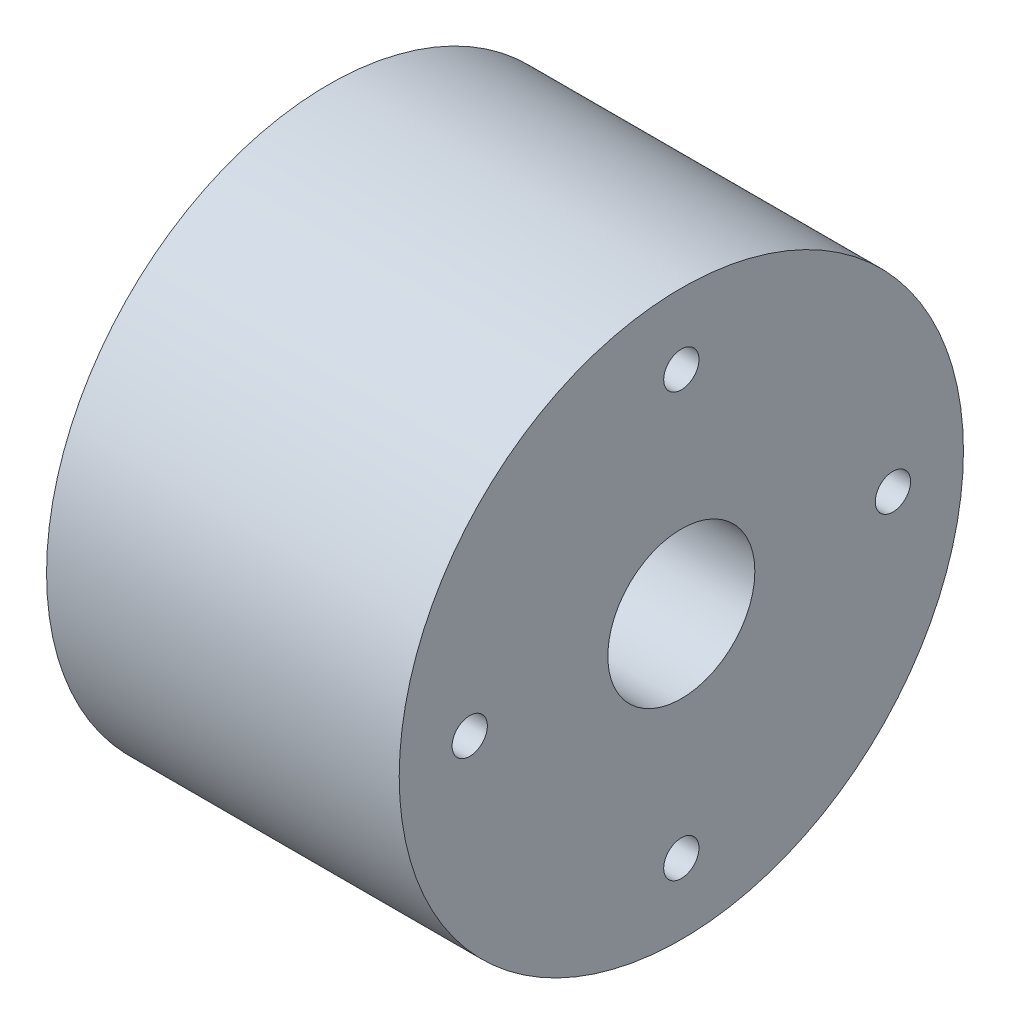
ISO-10303-21;
HEADER;
FILE_DESCRIPTION(('STEP AP214'),'2;1');
FILE_NAME('part.step','',(''),(''),'','','');
FILE_SCHEMA(('AUTOMOTIVE_DESIGN { 1 0 10303 214 1 1 1 1 }'));
ENDSEC;
DATA;
#1=APPLICATION_CONTEXT('core data for automotive mechanical design processes');
#2=APPLICATION_PROTOCOL_DEFINITION('international standard','automotive_design',2000,#1);
#3=PRODUCT_CONTEXT('',#1,'mechanical');
#4=PRODUCT('Part','Part','',(#3));
#5=PRODUCT_RELATED_PRODUCT_CATEGORY('part','',(#4));
#6=PRODUCT_DEFINITION_FORMATION('','',#4);
#7=PRODUCT_DEFINITION_CONTEXT('part definition',#1,'design');
#8=PRODUCT_DEFINITION('design','',#6,#7);
#9=PRODUCT_DEFINITION_SHAPE('','',#8);
#10=(LENGTH_UNIT() NAMED_UNIT(*) SI_UNIT(.MILLI.,.METRE.));
#11=(NAMED_UNIT(*) PLANE_ANGLE_UNIT() SI_UNIT($,.RADIAN.));
#12=(NAMED_UNIT(*) SI_UNIT($,.STERADIAN.) SOLID_ANGLE_UNIT());
#13=UNCERTAINTY_MEASURE_WITH_UNIT(LENGTH_MEASURE(1.E-05),#10,'distance_accuracy_value','');
#14=(GEOMETRIC_REPRESENTATION_CONTEXT(3) GLOBAL_UNCERTAINTY_ASSIGNED_CONTEXT((#13)) GLOBAL_UNIT_ASSIGNED_CONTEXT((#10,
#11,#12)) REPRESENTATION_CONTEXT('',''));
#15=CARTESIAN_POINT('',(0.,0.,0.));
#16=DIRECTION('',(0.,0.,1.));
#17=DIRECTION('',(1.,0.,0.));
#18=AXIS2_PLACEMENT_3D('',#15,#16,#17);
#19=CARTESIAN_POINT('',(20.1841307962118,0.,0.));
#20=DIRECTION('',(1.,0.,0.));
#21=DIRECTION('',(0.,0.,-1.));
#22=AXIS2_PLACEMENT_3D('',#19,#20,#21);
#23=CONICAL_SURFACE('',#22,0.306445106204136,1.02974425867666);
#24=CARTESIAN_POINT('',(21.7569753252096,-2.8058432621717,-0.823160137823178));
#25=CARTESIAN_POINT('',(21.7874383125362,-2.84305838037642,-0.876413257971073));
#26=CARTESIAN_POINT('',(21.8200390797261,-2.88427445650211,-0.925703410803469));
#27=CARTESIAN_POINT('',(21.8880371020542,-2.97390438641946,-1.01501221212961));
#28=CARTESIAN_POINT('',(21.9234370201495,-3.02232513389705,-1.05502188586433));
#29=CARTESIAN_POINT('',(21.9956963618793,-3.12525645303338,-1.124583805993));
#30=CARTESIAN_POINT('',(22.0325562026601,-3.17976877347153,-1.15413303918569));
#31=CARTESIAN_POINT('',(22.1065180268135,-3.29341319869722,-1.201795402754));
#32=CARTESIAN_POINT('',(22.1436199328311,-3.35254388810428,-1.21991202152147));
#33=CARTESIAN_POINT('',(22.2165360095189,-3.47289426516142,-1.24391604386737));
#34=CARTESIAN_POINT('',(22.2523607370259,-3.53407579549554,-1.24996261539343));
#35=CARTESIAN_POINT('',(22.322360017575,-3.65738568551828,-1.25003703234416));
#36=CARTESIAN_POINT('',(22.3565346074909,-3.71951402400879,-1.24406514645931));
#37=CARTESIAN_POINT('',(22.4220446595724,-3.84189990232103,-1.22038242253208));
#38=CARTESIAN_POINT('',(22.45341251451,-3.9021714032024,-1.20283297243127));
#39=CARTESIAN_POINT('',(22.513242776736,-4.01982888476522,-1.15662788436148));
#40=CARTESIAN_POINT('',(22.5417052296006,-4.07721491070327,-1.12797242064376));
#41=CARTESIAN_POINT('',(22.5952267490602,-4.187253627662,-1.06038946489044));
#42=CARTESIAN_POINT('',(22.6202887578174,-4.2399103970607,-1.02147093970107));
#43=CARTESIAN_POINT('',(22.6666599546168,-4.33890577963995,-0.934446946583135));
#44=CARTESIAN_POINT('',(22.6879690704702,-4.38524427128135,-0.88634130197276));
#45=CARTESIAN_POINT('',(22.7266103979455,-4.47032975915403,-0.782089472977424));
#46=CARTESIAN_POINT('',(22.7439265932995,-4.50904609393442,-0.725912325194236));
#47=CARTESIAN_POINT('',(22.7742402693993,-4.57744659735273,-0.607248091170328));
#48=CARTESIAN_POINT('',(22.7872376957597,-4.60713065224851,-0.544760925481715));
#49=CARTESIAN_POINT('',(22.8087659118092,-4.65658739427296,-0.415106457470152));
#50=CARTESIAN_POINT('',(22.8172874219731,-4.67633948674586,-0.347929756638798));
#51=CARTESIAN_POINT('',(22.829712605375,-4.70521660869565,-0.210917830829612));
#52=CARTESIAN_POINT('',(22.8336162865962,-4.71434165654452,-0.141082610448035));
#53=CARTESIAN_POINT('',(22.8367553112947,-4.72167549458944,-0.000754990489772449));
#54=CARTESIAN_POINT('',(22.8359918345134,-4.71988704344678,0.0697372385134571));
#55=CARTESIAN_POINT('',(22.829809088094,-4.70545685640737,0.209394051631467));
#56=CARTESIAN_POINT('',(22.8243898175163,-4.69281511832025,0.278558635478305));
#57=CARTESIAN_POINT('',(22.808966678252,-4.65708095344441,0.413584261403495));
#58=CARTESIAN_POINT('',(22.7989636767369,-4.63399050340176,0.479445925729918));
#59=CARTESIAN_POINT('',(22.7745030435375,-4.57808631665275,0.606014035714722));
#60=CARTESIAN_POINT('',(22.760045382211,-4.54527251524524,0.666720447065553));
#61=CARTESIAN_POINT('',(22.7268582780022,-4.47093347549782,0.781287348015915));
#62=CARTESIAN_POINT('',(22.7081266789161,-4.42940384086626,0.835144360657762));
#63=CARTESIAN_POINT('',(22.6666530370252,-4.33894816613994,0.934447130790804));
#64=CARTESIAN_POINT('',(22.6439110010136,-4.29002213857397,0.97989290252955));
#65=CARTESIAN_POINT('',(22.5947698753586,-4.18636146644261,1.06104176340976));
#66=CARTESIAN_POINT('',(22.5683741083117,-4.13163210971649,1.09675361766377));
#67=CARTESIAN_POINT('',(22.5123265005268,-4.01805689886531,1.15747114786193));
#68=CARTESIAN_POINT('',(22.4826747566335,-3.95921116719514,1.18247714212906));
#69=CARTESIAN_POINT('',(22.420745829551,-3.83948451012323,1.22101084092432));
#70=CARTESIAN_POINT('',(22.3884786507564,-3.77861182014202,1.23458021340777));
#71=CARTESIAN_POINT('',(22.3218520799576,-3.65653235585074,1.25004491770107));
#72=CARTESIAN_POINT('',(22.2874927606581,-3.59532559321736,1.25194065495187));
#73=CARTESIAN_POINT('',(22.2175116341931,-3.47458732672301,1.24408275150683));
#74=CARTESIAN_POINT('',(22.181892828285,-3.41505237651975,1.23435520316492));
#75=CARTESIAN_POINT('',(22.1101952139891,-3.29924968363659,1.20366464204055));
#76=CARTESIAN_POINT('',(22.0741163939704,-3.24298202376608,1.18270134462598));
#77=CARTESIAN_POINT('',(22.0022159551355,-3.1348021889888,1.13001246781366));
#78=CARTESIAN_POINT('',(21.9663986791908,-3.0829283091617,1.09820242936436));
#79=CARTESIAN_POINT('',(21.8964680335826,-2.98530441333957,1.02480860699739));
#80=CARTESIAN_POINT('',(21.8623549257769,-2.93955533666192,0.983223326609433));
#81=CARTESIAN_POINT('',(21.7964986209569,-2.85434624777367,0.890528969477287));
#82=CARTESIAN_POINT('',(21.7648129131816,-2.81502256306382,0.839253636513139));
#83=CARTESIAN_POINT('',(21.7060388781682,-2.74447484443439,0.729046225938822));
#84=CARTESIAN_POINT('',(21.6789512268905,-2.71325200106396,0.670113024789517));
#85=CARTESIAN_POINT('',(21.6308535846422,-2.65931242390771,0.54580856112884));
#86=CARTESIAN_POINT('',(21.6098715432546,-2.63663467158522,0.480409472534257));
#87=CARTESIAN_POINT('',(21.5757068290098,-2.60037795471094,0.345208188318716));
#88=CARTESIAN_POINT('',(21.5625203247136,-2.58679451994513,0.275408174414153));
#89=CARTESIAN_POINT('',(21.5454688124565,-2.56933899256688,0.136538377507651));
#90=CARTESIAN_POINT('',(21.5412325712147,-2.56507986347478,0.0675629317929708));
#91=CARTESIAN_POINT('',(21.5413500479827,-2.56519836960111,-0.0703786890689812));
#92=CARTESIAN_POINT('',(21.5457036232849,-2.56957586133451,-0.139344864351231));
#93=CARTESIAN_POINT('',(21.5622861698721,-2.5865582227367,-0.272602802961375));
#94=CARTESIAN_POINT('',(21.5742151117134,-2.59884989126561,-0.33697295722867));
#95=CARTESIAN_POINT('',(21.604754105129,-2.63116037203344,-0.462043704599544));
#96=CARTESIAN_POINT('',(21.6233602456959,-2.65117466144914,-0.52274642154909));
#97=CARTESIAN_POINT('',(21.6606892910898,-2.69266369247958,-0.624458506012913));
#98=CARTESIAN_POINT('',(21.6782123062183,-2.71251291605974,-0.666588421817636));
#99=CARTESIAN_POINT('',(21.715806788191,-2.75621605421391,-0.747499298855928));
#100=CARTESIAN_POINT('',(21.735878400378,-2.78007019720778,-0.786280068880417));
#101=CARTESIAN_POINT('',(21.7569753252096,-2.8058432621717,-0.823160137823178));
#102=B_SPLINE_CURVE_WITH_KNOTS('',3,(#24,#25,#26,#27,#28,#29,#30,#31,#32,#33,#34,#35,#36,#37,
#38,#39,#40,#41,#42,#43,#44,#45,#46,#47,#48,#49,#50,#51,#52,#53,#54,#55,#56,#57,#58,#59,#60,#61,
#62,#63,#64,#65,#66,#67,#68,#69,#70,#71,#72,#73,#74,#75,#76,#77,#78,#79,#80,#81,#82,#83,#84,#85,
#86,#87,#88,#89,#90,#91,#92,#93,#94,#95,#96,#97,#98,#99,#100,#101),.UNSPECIFIED.,.T.,.F.,(4,2,2,
2,2,2,2,2,2,2,2,2,2,2,2,2,2,2,2,2,2,2,2,2,2,2,2,2,2,2,2,2,2,2,2,2,2,2,4),(0.,0.21508866097157,
0.430384465876376,0.645742237838034,0.861034266657122,1.0734679689099,1.28589692194424,
1.49542553175993,1.70495085424429,1.9142937173127,2.12364060675746,2.33381315484713,
2.54398834949804,2.75459757900533,2.96520644441152,3.17576207533657,3.386317748755,
3.5968336047101,3.80735086151156,4.01797456014096,4.22859790199787,4.43903095227682,
4.6494577452046,4.85911451793178,5.06876400895801,5.27794375438451,5.48712879915379,
5.69798135507559,5.90886621099758,6.12376628004212,6.33869791424668,6.5545984947129,
6.77039287350386,6.97704525134383,7.18369419598053,7.38262958872909,7.58144864956062,
7.73039827105936,7.87935639076028),.UNSPECIFIED.);
#103=CARTESIAN_POINT('',(21.7569753252096,-2.8058432621717,-0.823160137823178));
#104=VERTEX_POINT('',#103);
#105=EDGE_CURVE('E149',#104,#104,#102,.T.);
#106=ORIENTED_EDGE('',*,*,#105,.T.);
#107=EDGE_LOOP('',(#106));
#108=FACE_BOUND('',#107,.T.);
#109=CARTESIAN_POINT('',(20.3004303095138,0.,0.));
#110=DIRECTION('',(1.,0.,0.));
#111=DIRECTION('',(0.,0.,-1.));
#112=AXIS2_PLACEMENT_3D('',#109,#110,#111);
#113=CIRCLE('',#112,0.5);
#114=CARTESIAN_POINT('',(20.3004303095138,0.,-0.5));
#115=VERTEX_POINT('',#114);
#116=EDGE_CURVE('E48',#115,#115,#113,.F.);
#117=ORIENTED_EDGE('',*,*,#116,.T.);
#118=EDGE_LOOP('',(#117));
#119=FACE_BOUND('',#118,.T.);
#120=CARTESIAN_POINT('',(26.2639719533623,0.,0.));
#121=DIRECTION('',(1.,0.,0.));
#122=DIRECTION('',(0.,0.,-1.));
#123=AXIS2_PLACEMENT_3D('',#120,#121,#122);
#124=CIRCLE('',#123,10.425);
#125=CARTESIAN_POINT('',(26.2639719533623,0.,-10.425));
#126=VERTEX_POINT('',#125);
#127=EDGE_CURVE('E10',#126,#126,#124,.T.);
#128=ORIENTED_EDGE('',*,*,#127,.T.);
#129=EDGE_LOOP('',(#128));
#130=FACE_BOUND('',#129,.T.);
#131=CARTESIAN_POINT('',(21.5593822835987,2.58359634850408,-0.245645422664106));
#132=CARTESIAN_POINT('',(21.5695214669164,2.59402730604599,-0.314177306279495));
#133=CARTESIAN_POINT('',(21.5838129981621,2.6088637710016,-0.381469941659691));
#134=CARTESIAN_POINT('',(21.6195602752938,2.64710729038966,-0.511624513631735));
#135=CARTESIAN_POINT('',(21.6410262607136,2.67052659907711,-0.574479961184829));
#136=CARTESIAN_POINT('',(21.6896077245914,2.72550020549803,-0.693950829219855));
#137=CARTESIAN_POINT('',(21.7167100344763,2.75703558113398,-0.750580332590314));
#138=CARTESIAN_POINT('',(21.7751196826283,2.82774978941251,-0.856378381172395));
#139=CARTESIAN_POINT('',(21.8064261308463,2.86692700500967,-0.905548500914562));
#140=CARTESIAN_POINT('',(21.8728138627703,2.95344911173589,-0.996509645920689));
#141=CARTESIAN_POINT('',(21.9079775393525,3.00099567250723,-1.0380492043219));
#142=CARTESIAN_POINT('',(21.9799421736678,3.102369702186,-1.1107647600005));
#143=CARTESIAN_POINT('',(22.0167431557037,3.15619726434238,-1.14194060338972));
#144=CARTESIAN_POINT('',(22.0906126923262,3.26850591381355,-1.19283723679874));
#145=CARTESIAN_POINT('',(22.1276795788614,3.32696744492935,-1.21260352639326));
#146=CARTESIAN_POINT('',(22.2011573941562,3.44703844318303,-1.2401796211442));
#147=CARTESIAN_POINT('',(22.2375683834649,3.50864761771152,-1.24799053560691));
#148=CARTESIAN_POINT('',(22.3081371489464,3.63191948318904,-1.25129653418279));
#149=CARTESIAN_POINT('',(22.3423245072475,3.6935591477386,-1.24702163532297));
#150=CARTESIAN_POINT('',(22.4084428269127,3.81610472959449,-1.22670930279617));
#151=CARTESIAN_POINT('',(22.4403738976676,3.8770106823542,-1.21067243981036));
#152=CARTESIAN_POINT('',(22.5011319454836,3.99569817933591,-1.1674362370394));
#153=CARTESIAN_POINT('',(22.5299810200784,4.05350024501194,-1.14032418893705));
#154=CARTESIAN_POINT('',(22.5843707495476,4.16467787475534,-1.07570101486658));
#155=CARTESIAN_POINT('',(22.6099113709878,4.2180533940873,-1.03818978381916));
#156=CARTESIAN_POINT('',(22.657349157342,4.31883313365053,-0.953723641497718));
#157=CARTESIAN_POINT('',(22.6792375366598,4.36622289028389,-0.906746541811621));
#158=CARTESIAN_POINT('',(22.7189855122762,4.45340487144892,-0.804729668021943));
#159=CARTESIAN_POINT('',(22.7368450321637,4.49319695188109,-0.749689741031666));
#160=CARTESIAN_POINT('',(22.7683501675582,4.56407017746498,-0.632886533587725));
#161=CARTESIAN_POINT('',(22.7819804994386,4.59511969180144,-0.571099934203673));
#162=CARTESIAN_POINT('',(22.8047608632575,4.64734247994267,-0.442714274097457));
#163=CARTESIAN_POINT('',(22.8139108727137,4.66851570418822,-0.376115189228172));
#164=CARTESIAN_POINT('',(22.8276179736411,4.70033269967395,-0.239933615734933));
#165=CARTESIAN_POINT('',(22.8321712244162,4.71096766582413,-0.170348682883437));
#166=CARTESIAN_POINT('',(22.8366127535017,4.72134089879729,-0.0302244067063192));
#167=CARTESIAN_POINT('',(22.8365010438764,4.72107919380095,0.0403149341505647));
#168=CARTESIAN_POINT('',(22.8316153588552,4.70967034946801,0.180308692007633));
#169=CARTESIAN_POINT('',(22.8268436874369,4.69852858944685,0.24976362791832));
#170=CARTESIAN_POINT('',(22.8127027881599,4.66571931888042,0.385653772501006));
#171=CARTESIAN_POINT('',(22.803333543964,4.64405177093249,0.452088970441656));
#172=CARTESIAN_POINT('',(22.7801161970879,4.59086732590091,0.58007111018011));
#173=CARTESIAN_POINT('',(22.7662670873444,4.55934821426254,0.641616948982879));
#174=CARTESIAN_POINT('',(22.7342731441423,4.48745268879275,0.758060321239843));
#175=CARTESIAN_POINT('',(22.7161282859345,4.44707622393129,0.812957816387983));
#176=CARTESIAN_POINT('',(22.6757856791607,4.35872375170547,0.914558640152046));
#177=CARTESIAN_POINT('',(22.6535869906915,4.31074598227852,0.961260063528345));
#178=CARTESIAN_POINT('',(22.6054597477567,4.20870802301076,1.04512288472035));
#179=CARTESIAN_POINT('',(22.5795312385742,4.15464790701619,1.08228439834285));
#180=CARTESIAN_POINT('',(22.5244083295794,4.04227501707531,1.14593876713344));
#181=CARTESIAN_POINT('',(22.4952211063303,3.98397168277632,1.17245449716574));
#182=CARTESIAN_POINT('',(22.4340362813725,3.86485110226613,1.21418540357519));
#183=CARTESIAN_POINT('',(22.4020387914181,3.80403395607116,1.22940102908998));
#184=CARTESIAN_POINT('',(22.3359782276105,3.68204040842363,1.24809356934501));
#185=CARTESIAN_POINT('',(22.3019238528211,3.62086638970972,1.25161681883899));
#186=CARTESIAN_POINT('',(22.232365896313,3.49979694207464,1.24701895213259));
#187=CARTESIAN_POINT('',(22.1968623353755,3.43990149483757,1.2388980028523));
#188=CARTESIAN_POINT('',(22.1252247888862,3.32308607199336,1.21131897269176));
#189=CARTESIAN_POINT('',(22.0890901455118,3.26616948307551,1.1918482807576));
#190=CARTESIAN_POINT('',(22.0172182617725,3.15694155855525,1.14220683851857));
#191=CARTESIAN_POINT('',(21.9814810492529,3.10463054388118,1.11203534328943));
#192=CARTESIAN_POINT('',(21.9110374319495,3.00521825446715,1.04140926491437));
#193=CARTESIAN_POINT('',(21.8763520948069,2.95819895727875,1.00081834914275));
#194=CARTESIAN_POINT('',(21.8098298722292,2.87123986619244,0.910691059365298));
#195=CARTESIAN_POINT('',(21.7779935175578,2.8313013900933,0.861153023683025));
#196=CARTESIAN_POINT('',(21.7180731937152,2.75861777236263,0.753454106528431));
#197=CARTESIAN_POINT('',(21.6900656395384,2.72601250698762,0.695156087010206));
#198=CARTESIAN_POINT('',(21.6400890573769,2.66947204260951,0.572095244589754));
#199=CARTESIAN_POINT('',(21.6181205814629,2.64553763620154,0.507331831381772));
#200=CARTESIAN_POINT('',(21.582060039216,2.60702076268718,0.374061159478935));
#201=CARTESIAN_POINT('',(21.5678604397524,2.59231018327059,0.305620213020378));
#202=CARTESIAN_POINT('',(21.5480888186189,2.57198771780298,0.166245232330943));
#203=CARTESIAN_POINT('',(21.5425040034896,2.56636233911171,0.0953150552894045));
#204=CARTESIAN_POINT('',(21.5408057280626,2.56465017740955,-0.0209919645208939));
#205=CARTESIAN_POINT('',(21.5419952105512,2.56584730963256,-0.0663227934320161));
#206=CARTESIAN_POINT('',(21.5480051091963,2.57194767414318,-0.156490299185511));
#207=CARTESIAN_POINT('',(21.5528254415036,2.57685082084573,-0.201326987415088));
#208=CARTESIAN_POINT('',(21.5593822835987,2.58359634850408,-0.245645422664106));
#209=B_SPLINE_CURVE_WITH_KNOTS('',3,(#131,#132,#133,#134,#135,#136,#137,#138,#139,#140,#141,
#142,#143,#144,#145,#146,#147,#148,#149,#150,#151,#152,#153,#154,#155,#156,#157,#158,#159,#160,
#161,#162,#163,#164,#165,#166,#167,#168,#169,#170,#171,#172,#173,#174,#175,#176,#177,#178,#179,
#180,#181,#182,#183,#184,#185,#186,#187,#188,#189,#190,#191,#192,#193,#194,#195,#196,#197,#198,
#199,#200,#201,#202,#203,#204,#205,#206,#207,#208),.UNSPECIFIED.,.T.,.F.,(4,2,2,2,2,2,2,2,2,2,2,
2,2,2,2,2,2,2,2,2,2,2,2,2,2,2,2,2,2,2,2,2,2,2,2,2,2,2,4),(0.,0.210001357688795,
0.420303722842498,0.630120154189581,0.839892235569145,1.05566802925889,1.27144702680563,
1.48635947722897,1.70125198530975,1.91208234619205,2.122902478429,2.33209209365293,
2.54128382272525,2.75097173324728,2.96066362036974,3.17110470501149,3.38154684563545,
3.59216467027441,3.80278195021899,4.01329514949115,4.22380909681295,4.43437040010449,
4.64493291653864,4.85554431519514,5.06615315707853,5.27630700484142,5.48645249931381,
5.69576422473742,5.90507294969826,6.11461468864495,6.32417101746601,6.5366230350117,
6.74911455020713,6.9653681998941,7.18164161214057,7.39484042776756,7.6077223248083,
7.74352986445932,7.87933426792747),.UNSPECIFIED.);
#210=CARTESIAN_POINT('',(21.5593822835987,2.58359634850408,-0.245645422664106));
#211=VERTEX_POINT('',#210);
#212=EDGE_CURVE('E126',#211,#211,#209,.T.);
#213=ORIENTED_EDGE('',*,*,#212,.F.);
#214=EDGE_LOOP('',(#213));
#215=FACE_BOUND('',#214,.T.);
#216=ADVANCED_FACE('F44',(#108,#119,#130,#215),#23,.F.);
#217=CARTESIAN_POINT('',(20.,0.,0.));
#218=DIRECTION('',(1.,0.,0.));
#219=DIRECTION('',(0.,0.,-1.));
#220=AXIS2_PLACEMENT_3D('',#217,#218,#219);
#221=CYLINDRICAL_SURFACE('',#220,10.425);
#222=CARTESIAN_POINT('',(50.,0.,0.));
#223=DIRECTION('',(1.,0.,0.));
#224=DIRECTION('',(0.,0.,-1.));
#225=AXIS2_PLACEMENT_3D('',#222,#223,#224);
#226=CIRCLE('',#225,10.425);
#227=CARTESIAN_POINT('',(50.,0.,-10.425));
#228=VERTEX_POINT('',#227);
#229=EDGE_CURVE('E65',#228,#228,#226,.T.);
#230=ORIENTED_EDGE('',*,*,#229,.T.);
#231=EDGE_LOOP('',(#230));
#232=FACE_BOUND('',#231,.T.);
#233=ORIENTED_EDGE('',*,*,#127,.F.);
#234=EDGE_LOOP('',(#233));
#235=FACE_BOUND('',#234,.T.);
#236=ADVANCED_FACE('F192',(#232,#235),#221,.F.);
#237=CARTESIAN_POINT('',(50.,0.,0.));
#238=DIRECTION('',(-1.,0.,0.));
#239=DIRECTION('',(0.,0.,1.));
#240=AXIS2_PLACEMENT_3D('',#237,#238,#239);
#241=CYLINDRICAL_SURFACE('',#240,40.);
#242=CARTESIAN_POINT('',(50.,0.,0.));
#243=DIRECTION('',(1.,0.,0.));
#244=DIRECTION('',(0.,0.,-1.));
#245=AXIS2_PLACEMENT_3D('',#242,#243,#244);
#246=CIRCLE('',#245,40.);
#247=CARTESIAN_POINT('',(50.,0.,-40.));
#248=VERTEX_POINT('',#247);
#249=EDGE_CURVE('E53',#248,#248,#246,.T.);
#250=ORIENTED_EDGE('',*,*,#249,.F.);
#251=EDGE_LOOP('',(#250));
#252=FACE_BOUND('',#251,.T.);
#253=CARTESIAN_POINT('',(0.,0.,0.));
#254=DIRECTION('',(1.,0.,0.));
#255=DIRECTION('',(0.,0.,-1.));
#256=AXIS2_PLACEMENT_3D('',#253,#254,#255);
#257=CIRCLE('',#256,40.);
#258=CARTESIAN_POINT('',(0.,0.,-40.));
#259=VERTEX_POINT('',#258);
#260=EDGE_CURVE('E60',#259,#259,#257,.T.);
#261=ORIENTED_EDGE('',*,*,#260,.T.);
#262=EDGE_LOOP('',(#261));
#263=FACE_BOUND('',#262,.T.);
#264=ADVANCED_FACE('F46',(#252,#263),#241,.T.);
#265=CARTESIAN_POINT('',(50.,0.,0.));
#266=DIRECTION('',(1.,0.,0.));
#267=DIRECTION('',(0.,0.,-1.));
#268=AXIS2_PLACEMENT_3D('',#265,#266,#267);
#269=PLANE('',#268);
#270=CARTESIAN_POINT('',(50.,30.,0.));
#271=DIRECTION('',(-1.,0.,0.));
#272=DIRECTION('',(0.,0.,1.));
#273=AXIS2_PLACEMENT_3D('',#270,#271,#272);
#274=CIRCLE('',#273,2.5);
#275=CARTESIAN_POINT('',(50.,30.,2.5));
#276=VERTEX_POINT('',#275);
#277=EDGE_CURVE('E83',#276,#276,#274,.T.);
#278=ORIENTED_EDGE('',*,*,#277,.T.);
#279=EDGE_LOOP('',(#278));
#280=FACE_BOUND('',#279,.T.);
#281=CARTESIAN_POINT('',(50.,8.47140372315957E-13,30.0000000000008));
#282=DIRECTION('',(-1.,0.,0.));
#283=DIRECTION('',(0.,0.,1.));
#284=AXIS2_PLACEMENT_3D('',#281,#282,#283);
#285=CIRCLE('',#284,2.50000000000066);
#286=CARTESIAN_POINT('',(50.,8.47140372315957E-13,32.5000000000015));
#287=VERTEX_POINT('',#286);
#288=EDGE_CURVE('E103',#287,#287,#285,.T.);
#289=ORIENTED_EDGE('',*,*,#288,.T.);
#290=EDGE_LOOP('',(#289));
#291=FACE_BOUND('',#290,.T.);
#292=CARTESIAN_POINT('',(50.,-30.,1.69428074463191E-12));
#293=DIRECTION('',(-1.,0.,0.));
#294=DIRECTION('',(0.,0.,1.));
#295=AXIS2_PLACEMENT_3D('',#292,#293,#294);
#296=CIRCLE('',#295,2.50000000000182);
#297=CARTESIAN_POINT('',(50.,-30.,2.50000000000351));
#298=VERTEX_POINT('',#297);
#299=EDGE_CURVE('E95',#298,#298,#296,.T.);
#300=ORIENTED_EDGE('',*,*,#299,.T.);
#301=EDGE_LOOP('',(#300));
#302=FACE_BOUND('',#301,.T.);
#303=CARTESIAN_POINT('',(50.,-8.50814312713399E-13,-29.9999999999992));
#304=DIRECTION('',(-1.,0.,0.));
#305=DIRECTION('',(0.,0.,1.));
#306=AXIS2_PLACEMENT_3D('',#303,#304,#305);
#307=CIRCLE('',#306,2.50000000000136);
#308=CARTESIAN_POINT('',(50.,-8.50814312713399E-13,-27.4999999999978));
#309=VERTEX_POINT('',#308);
#310=EDGE_CURVE('E87',#309,#309,#307,.T.);
#311=ORIENTED_EDGE('',*,*,#310,.T.);
#312=EDGE_LOOP('',(#311));
#313=FACE_BOUND('',#312,.T.);
#314=ORIENTED_EDGE('',*,*,#229,.F.);
#315=EDGE_LOOP('',(#314));
#316=FACE_BOUND('',#315,.T.);
#317=ORIENTED_EDGE('',*,*,#249,.T.);
#318=EDGE_LOOP('',(#317));
#319=FACE_BOUND('',#318,.T.);
#320=ADVANCED_FACE('F186',(#280,#291,#302,#313,#316,#319),#269,.T.);
#321=CARTESIAN_POINT('',(0.,0.,0.));
#322=DIRECTION('',(1.,0.,0.));
#323=DIRECTION('',(0.,0.,-1.));
#324=AXIS2_PLACEMENT_3D('',#321,#322,#323);
#325=PLANE('',#324);
#326=CARTESIAN_POINT('',(0.,30.,0.));
#327=DIRECTION('',(-1.,0.,0.));
#328=DIRECTION('',(0.,0.,1.));
#329=AXIS2_PLACEMENT_3D('',#326,#327,#328);
#330=CIRCLE('',#329,2.5);
#331=CARTESIAN_POINT('',(0.,30.,2.5));
#332=VERTEX_POINT('',#331);
#333=EDGE_CURVE('E111',#332,#332,#330,.T.);
#334=ORIENTED_EDGE('',*,*,#333,.F.);
#335=EDGE_LOOP('',(#334));
#336=FACE_BOUND('',#335,.T.);
#337=CARTESIAN_POINT('',(0.,8.47140372315957E-13,30.0000000000008));
#338=DIRECTION('',(-1.,0.,0.));
#339=DIRECTION('',(0.,0.,1.));
#340=AXIS2_PLACEMENT_3D('',#337,#338,#339);
#341=CIRCLE('',#340,2.50000000000066);
#342=CARTESIAN_POINT('',(0.,8.47140372315957E-13,32.5000000000015));
#343=VERTEX_POINT('',#342);
#344=EDGE_CURVE('E107',#343,#343,#341,.T.);
#345=ORIENTED_EDGE('',*,*,#344,.F.);
#346=EDGE_LOOP('',(#345));
#347=FACE_BOUND('',#346,.T.);
#348=CARTESIAN_POINT('',(0.,-30.,1.69428074463191E-12));
#349=DIRECTION('',(-1.,0.,0.));
#350=DIRECTION('',(0.,0.,1.));
#351=AXIS2_PLACEMENT_3D('',#348,#349,#350);
#352=CIRCLE('',#351,2.50000000000182);
#353=CARTESIAN_POINT('',(0.,-30.,2.50000000000351));
#354=VERTEX_POINT('',#353);
#355=EDGE_CURVE('E99',#354,#354,#352,.T.);
#356=ORIENTED_EDGE('',*,*,#355,.F.);
#357=EDGE_LOOP('',(#356));
#358=FACE_BOUND('',#357,.T.);
#359=CARTESIAN_POINT('',(0.,-8.50814312713399E-13,-29.9999999999992));
#360=DIRECTION('',(-1.,0.,0.));
#361=DIRECTION('',(0.,0.,1.));
#362=AXIS2_PLACEMENT_3D('',#359,#360,#361);
#363=CIRCLE('',#362,2.50000000000136);
#364=CARTESIAN_POINT('',(0.,-8.50814312713399E-13,-27.4999999999978));
#365=VERTEX_POINT('',#364);
#366=EDGE_CURVE('E91',#365,#365,#363,.T.);
#367=ORIENTED_EDGE('',*,*,#366,.F.);
#368=EDGE_LOOP('',(#367));
#369=FACE_BOUND('',#368,.T.);
#370=CARTESIAN_POINT('',(0.,0.,0.));
#371=DIRECTION('',(-1.,0.,0.));
#372=DIRECTION('',(0.,0.,1.));
#373=AXIS2_PLACEMENT_3D('',#370,#371,#372);
#374=CIRCLE('',#373,20.);
#375=CARTESIAN_POINT('',(0.,0.,20.));
#376=VERTEX_POINT('',#375);
#377=EDGE_CURVE('E71',#376,#376,#374,.T.);
#378=ORIENTED_EDGE('',*,*,#377,.F.);
#379=EDGE_LOOP('',(#378));
#380=FACE_BOUND('',#379,.T.);
#381=ORIENTED_EDGE('',*,*,#260,.F.);
#382=EDGE_LOOP('',(#381));
#383=FACE_BOUND('',#382,.T.);
#384=ADVANCED_FACE('F180',(#336,#347,#358,#369,#380,#383),#325,.F.);
#385=CARTESIAN_POINT('',(5.,0.,0.));
#386=DIRECTION('',(-1.,0.,0.));
#387=DIRECTION('',(0.,0.,1.));
#388=AXIS2_PLACEMENT_3D('',#385,#386,#387);
#389=CYLINDRICAL_SURFACE('',#388,20.);
#390=CARTESIAN_POINT('',(5.,0.,0.));
#391=DIRECTION('',(-1.,0.,0.));
#392=DIRECTION('',(0.,0.,1.));
#393=AXIS2_PLACEMENT_3D('',#390,#391,#392);
#394=CIRCLE('',#393,20.);
#395=CARTESIAN_POINT('',(5.,0.,20.));
#396=VERTEX_POINT('',#395);
#397=EDGE_CURVE('E70',#396,#396,#394,.T.);
#398=ORIENTED_EDGE('',*,*,#397,.F.);
#399=EDGE_LOOP('',(#398));
#400=FACE_BOUND('',#399,.T.);
#401=ORIENTED_EDGE('',*,*,#377,.T.);
#402=EDGE_LOOP('',(#401));
#403=FACE_BOUND('',#402,.T.);
#404=ADVANCED_FACE('F170',(#400,#403),#389,.F.);
#405=CARTESIAN_POINT('',(5.,0.,0.));
#406=DIRECTION('',(-1.,0.,0.));
#407=DIRECTION('',(0.,0.,1.));
#408=AXIS2_PLACEMENT_3D('',#405,#406,#407);
#409=PLANE('',#408);
#410=CARTESIAN_POINT('',(5.,-11.657691453875,0.));
#411=DIRECTION('',(-1.,0.,0.));
#412=DIRECTION('',(0.,1.,0.));
#413=AXIS2_PLACEMENT_3D('',#410,#411,#412);
#414=ELLIPSE('',#413,1.37922239870312,1.25);
#415=CARTESIAN_POINT('',(5.,-10.2784690551719,0.));
#416=VERTEX_POINT('',#415);
#417=EDGE_CURVE('E135',#416,#416,#414,.F.);
#418=ORIENTED_EDGE('',*,*,#417,.T.);
#419=EDGE_LOOP('',(#418));
#420=FACE_BOUND('',#419,.T.);
#421=CARTESIAN_POINT('',(5.,11.657691453875,0.));
#422=DIRECTION('',(-1.,0.,0.));
#423=DIRECTION('',(0.,-1.,0.));
#424=AXIS2_PLACEMENT_3D('',#421,#422,#423);
#425=ELLIPSE('',#424,1.37922239870312,1.25);
#426=CARTESIAN_POINT('',(5.,10.2784690551719,0.));
#427=VERTEX_POINT('',#426);
#428=EDGE_CURVE('E122',#427,#427,#425,.T.);
#429=ORIENTED_EDGE('',*,*,#428,.F.);
#430=EDGE_LOOP('',(#429));
#431=FACE_BOUND('',#430,.T.);
#432=CARTESIAN_POINT('',(5.,0.,0.));
#433=DIRECTION('',(-1.,0.,0.));
#434=DIRECTION('',(0.,0.,1.));
#435=AXIS2_PLACEMENT_3D('',#432,#433,#434);
#436=CIRCLE('',#435,10.);
#437=CARTESIAN_POINT('',(5.,0.,10.));
#438=VERTEX_POINT('',#437);
#439=EDGE_CURVE('E75',#438,#438,#436,.T.);
#440=ORIENTED_EDGE('',*,*,#439,.F.);
#441=EDGE_LOOP('',(#440));
#442=FACE_BOUND('',#441,.T.);
#443=ORIENTED_EDGE('',*,*,#397,.T.);
#444=EDGE_LOOP('',(#443));
#445=FACE_BOUND('',#444,.T.);
#446=ADVANCED_FACE('F165',(#420,#431,#442,#445),#409,.T.);
#447=CARTESIAN_POINT('',(5.,0.,0.));
#448=DIRECTION('',(-1.,0.,0.));
#449=DIRECTION('',(0.,0.,1.));
#450=AXIS2_PLACEMENT_3D('',#447,#448,#449);
#451=CYLINDRICAL_SURFACE('',#450,10.);
#452=ORIENTED_EDGE('',*,*,#439,.T.);
#453=EDGE_LOOP('',(#452));
#454=FACE_BOUND('',#453,.T.);
#455=CARTESIAN_POINT('',(0.,0.,0.));
#456=DIRECTION('',(-1.,0.,0.));
#457=DIRECTION('',(0.,0.,1.));
#458=AXIS2_PLACEMENT_3D('',#455,#456,#457);
#459=CIRCLE('',#458,10.);
#460=CARTESIAN_POINT('',(0.,0.,10.));
#461=VERTEX_POINT('',#460);
#462=EDGE_CURVE('E79',#461,#461,#459,.T.);
#463=ORIENTED_EDGE('',*,*,#462,.F.);
#464=EDGE_LOOP('',(#463));
#465=FACE_BOUND('',#464,.T.);
#466=ADVANCED_FACE('F169',(#454,#465),#451,.T.);
#467=CARTESIAN_POINT('',(0.,0.,0.));
#468=DIRECTION('',(-1.,0.,0.));
#469=DIRECTION('',(0.,0.,1.));
#470=AXIS2_PLACEMENT_3D('',#467,#468,#469);
#471=CIRCLE('',#470,0.5);
#472=CARTESIAN_POINT('',(0.,0.,0.5));
#473=VERTEX_POINT('',#472);
#474=EDGE_CURVE('E118',#473,#473,#471,.T.);
#475=ORIENTED_EDGE('',*,*,#474,.F.);
#476=EDGE_LOOP('',(#475));
#477=FACE_BOUND('',#476,.T.);
#478=ORIENTED_EDGE('',*,*,#462,.T.);
#479=EDGE_LOOP('',(#478));
#480=FACE_BOUND('',#479,.T.);
#481=ADVANCED_FACE('F188',(#477,#480),#325,.F.);
#482=CARTESIAN_POINT('',(50.,-8.50814312713399E-13,-29.9999999999992));
#483=DIRECTION('',(-1.,0.,0.));
#484=DIRECTION('',(0.,0.,1.));
#485=AXIS2_PLACEMENT_3D('',#482,#483,#484);
#486=CYLINDRICAL_SURFACE('',#485,2.50000000000136);
#487=ORIENTED_EDGE('',*,*,#310,.F.);
#488=EDGE_LOOP('',(#487));
#489=FACE_BOUND('',#488,.T.);
#490=ORIENTED_EDGE('',*,*,#366,.T.);
#491=EDGE_LOOP('',(#490));
#492=FACE_BOUND('',#491,.T.);
#493=ADVANCED_FACE('F222',(#489,#492),#486,.F.);
#494=CARTESIAN_POINT('',(50.,-30.,1.69428074463191E-12));
#495=DIRECTION('',(-1.,0.,0.));
#496=DIRECTION('',(0.,0.,1.));
#497=AXIS2_PLACEMENT_3D('',#494,#495,#496);
#498=CYLINDRICAL_SURFACE('',#497,2.50000000000182);
#499=ORIENTED_EDGE('',*,*,#299,.F.);
#500=EDGE_LOOP('',(#499));
#501=FACE_BOUND('',#500,.T.);
#502=ORIENTED_EDGE('',*,*,#355,.T.);
#503=EDGE_LOOP('',(#502));
#504=FACE_BOUND('',#503,.T.);
#505=ADVANCED_FACE('F218',(#501,#504),#498,.F.);
#506=CARTESIAN_POINT('',(50.,8.47140372315957E-13,30.0000000000008));
#507=DIRECTION('',(-1.,0.,0.));
#508=DIRECTION('',(0.,0.,1.));
#509=AXIS2_PLACEMENT_3D('',#506,#507,#508);
#510=CYLINDRICAL_SURFACE('',#509,2.50000000000066);
#511=ORIENTED_EDGE('',*,*,#288,.F.);
#512=EDGE_LOOP('',(#511));
#513=FACE_BOUND('',#512,.T.);
#514=ORIENTED_EDGE('',*,*,#344,.T.);
#515=EDGE_LOOP('',(#514));
#516=FACE_BOUND('',#515,.T.);
#517=ADVANCED_FACE('F214',(#513,#516),#510,.F.);
#518=CARTESIAN_POINT('',(50.,30.,0.));
#519=DIRECTION('',(-1.,0.,0.));
#520=DIRECTION('',(0.,0.,1.));
#521=AXIS2_PLACEMENT_3D('',#518,#519,#520);
#522=CYLINDRICAL_SURFACE('',#521,2.5);
#523=ORIENTED_EDGE('',*,*,#277,.F.);
#524=EDGE_LOOP('',(#523));
#525=FACE_BOUND('',#524,.T.);
#526=ORIENTED_EDGE('',*,*,#333,.T.);
#527=EDGE_LOOP('',(#526));
#528=FACE_BOUND('',#527,.T.);
#529=ADVANCED_FACE('F211',(#525,#528),#522,.F.);
#530=CARTESIAN_POINT('',(50.,0.,0.));
#531=DIRECTION('',(-1.,0.,0.));
#532=DIRECTION('',(0.,0.,1.));
#533=AXIS2_PLACEMENT_3D('',#530,#531,#532);
#534=CYLINDRICAL_SURFACE('',#533,0.5);
#535=ORIENTED_EDGE('',*,*,#474,.T.);
#536=EDGE_LOOP('',(#535));
#537=FACE_BOUND('',#536,.T.);
#538=ORIENTED_EDGE('',*,*,#116,.F.);
#539=EDGE_LOOP('',(#538));
#540=FACE_BOUND('',#539,.T.);
#541=ADVANCED_FACE('F210',(#537,#540),#534,.F.);
#542=CARTESIAN_POINT('',(-9.96390742370405,18.6354760814706,0.));
#543=DIRECTION('',(0.906307787036649,-0.4226182617407,0.));
#544=DIRECTION('',(0.4226182617407,0.90630778703665,0.));
#545=AXIS2_PLACEMENT_3D('',#542,#543,#544);
#546=CYLINDRICAL_SURFACE('',#545,1.25);
#547=ORIENTED_EDGE('',*,*,#428,.T.);
#548=EDGE_LOOP('',(#547));
#549=FACE_BOUND('',#548,.T.);
#550=ORIENTED_EDGE('',*,*,#212,.T.);
#551=EDGE_LOOP('',(#550));
#552=FACE_BOUND('',#551,.T.);
#553=ADVANCED_FACE('F144',(#549,#552),#546,.F.);
#554=CARTESIAN_POINT('',(-9.96390742370405,-18.6354760814706,0.));
#555=DIRECTION('',(0.906307787036649,0.4226182617407,0.));
#556=DIRECTION('',(-0.4226182617407,0.90630778703665,0.));
#557=AXIS2_PLACEMENT_3D('',#554,#555,#556);
#558=CYLINDRICAL_SURFACE('',#557,1.25);
#559=ORIENTED_EDGE('',*,*,#417,.F.);
#560=EDGE_LOOP('',(#559));
#561=FACE_BOUND('',#560,.T.);
#562=ORIENTED_EDGE('',*,*,#105,.F.);
#563=EDGE_LOOP('',(#562));
#564=FACE_BOUND('',#563,.T.);
#565=ADVANCED_FACE('F141',(#561,#564),#558,.F.);
#566=CLOSED_SHELL('',(#216,#236,#264,#320,#384,#404,#446,#466,#481,#493,#505,#517,#529,#541,
#553,#565));
#567=MANIFOLD_SOLID_BREP('B2',#566);
#568=ADVANCED_BREP_SHAPE_REPRESENTATION('',(#18,#567),#14);
#569=SHAPE_DEFINITION_REPRESENTATION(#9,#568);
ENDSEC;
END-ISO-10303-21;
